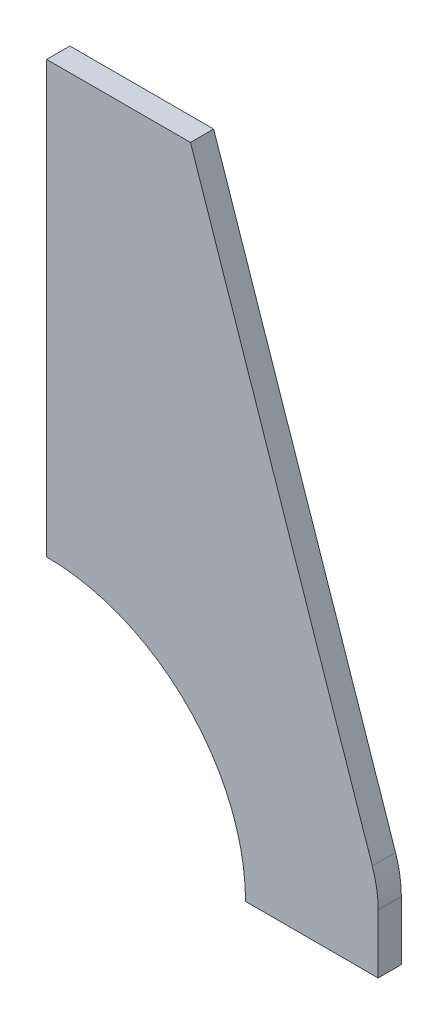
ISO-10303-21;
HEADER;
FILE_DESCRIPTION(('STEP AP214'),'2;1');
FILE_NAME('part.step','',(''),(''),'','','');
FILE_SCHEMA(('AUTOMOTIVE_DESIGN { 1 0 10303 214 1 1 1 1 }'));
ENDSEC;
DATA;
#1=APPLICATION_CONTEXT('core data for automotive mechanical design processes');
#2=APPLICATION_PROTOCOL_DEFINITION('international standard','automotive_design',2000,#1);
#3=PRODUCT_CONTEXT('',#1,'mechanical');
#4=PRODUCT('Part','Part','',(#3));
#5=PRODUCT_RELATED_PRODUCT_CATEGORY('part','',(#4));
#6=PRODUCT_DEFINITION_FORMATION('','',#4);
#7=PRODUCT_DEFINITION_CONTEXT('part definition',#1,'design');
#8=PRODUCT_DEFINITION('design','',#6,#7);
#9=PRODUCT_DEFINITION_SHAPE('','',#8);
#10=(LENGTH_UNIT() NAMED_UNIT(*) SI_UNIT(.MILLI.,.METRE.));
#11=(NAMED_UNIT(*) PLANE_ANGLE_UNIT() SI_UNIT($,.RADIAN.));
#12=(NAMED_UNIT(*) SI_UNIT($,.STERADIAN.) SOLID_ANGLE_UNIT());
#13=UNCERTAINTY_MEASURE_WITH_UNIT(LENGTH_MEASURE(1.E-05),#10,'distance_accuracy_value','');
#14=(GEOMETRIC_REPRESENTATION_CONTEXT(3) GLOBAL_UNCERTAINTY_ASSIGNED_CONTEXT((#13)) GLOBAL_UNIT_ASSIGNED_CONTEXT((#10,
#11,#12)) REPRESENTATION_CONTEXT('',''));
#15=CARTESIAN_POINT('',(0.,0.,0.));
#16=DIRECTION('',(0.,0.,1.));
#17=DIRECTION('',(1.,0.,0.));
#18=AXIS2_PLACEMENT_3D('',#15,#16,#17);
#19=CARTESIAN_POINT('',(26.9481859027112,238.391267528842,7.));
#20=DIRECTION('',(-0.946900493625646,-0.321526756540583,0.));
#21=DIRECTION('',(0.321526756540583,-0.946900493625646,0.));
#22=AXIS2_PLACEMENT_3D('',#19,#20,#21);
#23=PLANE('',#22);
#24=DIRECTION('',(0.,0.,-1.));
#25=VECTOR('',#24,1.);
#26=CARTESIAN_POINT('',(43.3797828848408,190.,7.));
#27=LINE('',#26,#25);
#28=CARTESIAN_POINT('',(43.3797828848408,190.,7.));
#29=VERTEX_POINT('',#28);
#30=CARTESIAN_POINT('',(43.3797828848408,190.,0.));
#31=VERTEX_POINT('',#30);
#32=EDGE_CURVE('E108',#29,#31,#27,.T.);
#33=ORIENTED_EDGE('',*,*,#32,.F.);
#34=DIRECTION('',(-0.321526756540583,0.946900493625646,0.));
#35=VECTOR('',#34,1.);
#36=CARTESIAN_POINT('',(26.9481859027112,238.391267528842,7.));
#37=LINE('',#36,#35);
#38=CARTESIAN_POINT('',(98.2477162896463,28.4132201493107,7.));
#39=VERTEX_POINT('',#38);
#40=EDGE_CURVE('E107',#39,#29,#37,.T.);
#41=ORIENTED_EDGE('',*,*,#40,.F.);
#42=DIRECTION('',(0.,0.,-1.));
#43=VECTOR('',#42,1.);
#44=CARTESIAN_POINT('',(98.2477162896463,28.4132201493107,7.));
#45=LINE('',#44,#43);
#46=CARTESIAN_POINT('',(98.2477162896463,28.4132201493107,0.));
#47=VERTEX_POINT('',#46);
#48=EDGE_CURVE('E144',#39,#47,#45,.T.);
#49=ORIENTED_EDGE('',*,*,#48,.T.);
#50=DIRECTION('',(-0.321526756540583,0.946900493625646,0.));
#51=VECTOR('',#50,1.);
#52=CARTESIAN_POINT('',(26.9481859027112,238.391267528842,0.));
#53=LINE('',#52,#51);
#54=EDGE_CURVE('E134',#47,#31,#53,.T.);
#55=ORIENTED_EDGE('',*,*,#54,.T.);
#56=EDGE_LOOP('',(#33,#41,#49,#55));
#57=FACE_BOUND('',#56,.T.);
#58=ADVANCED_FACE('F39',(#57),#23,.F.);
#59=CARTESIAN_POINT('',(0.,240.,7.));
#60=DIRECTION('',(0.,0.,1.));
#61=DIRECTION('',(1.,0.,0.));
#62=AXIS2_PLACEMENT_3D('',#59,#60,#61);
#63=PLANE('',#62);
#64=ORIENTED_EDGE('',*,*,#40,.T.);
#65=DIRECTION('',(-1.,0.,0.));
#66=VECTOR('',#65,1.);
#67=CARTESIAN_POINT('',(0.,190.,7.));
#68=LINE('',#67,#66);
#69=CARTESIAN_POINT('',(0.,190.,7.));
#70=VERTEX_POINT('',#69);
#71=EDGE_CURVE('E96',#29,#70,#68,.T.);
#72=ORIENTED_EDGE('',*,*,#71,.T.);
#73=DIRECTION('',(0.,1.,0.));
#74=VECTOR('',#73,1.);
#75=CARTESIAN_POINT('',(0.,240.,7.));
#76=LINE('',#75,#74);
#77=CARTESIAN_POINT('',(0.,60.,7.));
#78=VERTEX_POINT('',#77);
#79=EDGE_CURVE('E104',#78,#70,#76,.T.);
#80=ORIENTED_EDGE('',*,*,#79,.F.);
#81=CARTESIAN_POINT('',(0.,0.,7.));
#82=DIRECTION('',(0.,0.,1.));
#83=DIRECTION('',(1.,0.,0.));
#84=AXIS2_PLACEMENT_3D('',#81,#82,#83);
#85=CIRCLE('',#84,60.);
#86=CARTESIAN_POINT('',(60.,0.,7.));
#87=VERTEX_POINT('',#86);
#88=EDGE_CURVE('E111',#87,#78,#85,.T.);
#89=ORIENTED_EDGE('',*,*,#88,.F.);
#90=DIRECTION('',(1.,0.,0.));
#91=VECTOR('',#90,1.);
#92=CARTESIAN_POINT('',(-100.,0.,7.));
#93=LINE('',#92,#91);
#94=CARTESIAN_POINT('',(100.,0.,7.));
#95=VERTEX_POINT('',#94);
#96=EDGE_CURVE('E129',#87,#95,#93,.T.);
#97=ORIENTED_EDGE('',*,*,#96,.T.);
#98=DIRECTION('',(0.,1.,0.));
#99=VECTOR('',#98,1.);
#100=CARTESIAN_POINT('',(100.,23.2527217567091,7.));
#101=LINE('',#100,#99);
#102=CARTESIAN_POINT('',(100.,17.8028371834714,7.));
#103=VERTEX_POINT('',#102);
#104=EDGE_CURVE('E124',#95,#103,#101,.T.);
#105=ORIENTED_EDGE('',*,*,#104,.T.);
#106=CARTESIAN_POINT('',(67.,17.8028371834714,7.));
#107=DIRECTION('',(0.,0.,1.));
#108=DIRECTION('',(1.,0.,0.));
#109=AXIS2_PLACEMENT_3D('',#106,#107,#108);
#110=CIRCLE('',#109,33.);
#111=EDGE_CURVE('E142',#103,#39,#110,.T.);
#112=ORIENTED_EDGE('',*,*,#111,.T.);
#113=EDGE_LOOP('',(#64,#72,#80,#89,#97,#105,#112));
#114=FACE_BOUND('',#113,.T.);
#115=ADVANCED_FACE('F102',(#114),#63,.T.);
#116=CARTESIAN_POINT('',(0.,240.,0.));
#117=DIRECTION('',(0.,0.,1.));
#118=DIRECTION('',(1.,0.,0.));
#119=AXIS2_PLACEMENT_3D('',#116,#117,#118);
#120=PLANE('',#119);
#121=DIRECTION('',(-1.,0.,0.));
#122=VECTOR('',#121,1.);
#123=CARTESIAN_POINT('',(0.,190.,0.));
#124=LINE('',#123,#122);
#125=CARTESIAN_POINT('',(0.,190.,0.));
#126=VERTEX_POINT('',#125);
#127=EDGE_CURVE('E53',#31,#126,#124,.T.);
#128=ORIENTED_EDGE('',*,*,#127,.F.);
#129=ORIENTED_EDGE('',*,*,#54,.F.);
#130=CARTESIAN_POINT('',(67.,17.8028371834714,0.));
#131=DIRECTION('',(0.,0.,1.));
#132=DIRECTION('',(1.,0.,0.));
#133=AXIS2_PLACEMENT_3D('',#130,#131,#132);
#134=CIRCLE('',#133,33.);
#135=CARTESIAN_POINT('',(100.,17.8028371834714,0.));
#136=VERTEX_POINT('',#135);
#137=EDGE_CURVE('E140',#47,#136,#134,.F.);
#138=ORIENTED_EDGE('',*,*,#137,.T.);
#139=DIRECTION('',(0.,1.,0.));
#140=VECTOR('',#139,1.);
#141=CARTESIAN_POINT('',(100.,23.2527217567091,0.));
#142=LINE('',#141,#140);
#143=CARTESIAN_POINT('',(100.,0.,0.));
#144=VERTEX_POINT('',#143);
#145=EDGE_CURVE('E123',#144,#136,#142,.T.);
#146=ORIENTED_EDGE('',*,*,#145,.F.);
#147=DIRECTION('',(1.,0.,0.));
#148=VECTOR('',#147,1.);
#149=CARTESIAN_POINT('',(-100.,0.,0.));
#150=LINE('',#149,#148);
#151=CARTESIAN_POINT('',(60.,0.,0.));
#152=VERTEX_POINT('',#151);
#153=EDGE_CURVE('E127',#152,#144,#150,.T.);
#154=ORIENTED_EDGE('',*,*,#153,.F.);
#155=CARTESIAN_POINT('',(0.,0.,0.));
#156=DIRECTION('',(0.,0.,1.));
#157=DIRECTION('',(1.,0.,0.));
#158=AXIS2_PLACEMENT_3D('',#155,#156,#157);
#159=CIRCLE('',#158,60.);
#160=CARTESIAN_POINT('',(0.,60.,0.));
#161=VERTEX_POINT('',#160);
#162=EDGE_CURVE('E113',#152,#161,#159,.T.);
#163=ORIENTED_EDGE('',*,*,#162,.T.);
#164=DIRECTION('',(0.,1.,0.));
#165=VECTOR('',#164,1.);
#166=CARTESIAN_POINT('',(0.,240.,0.));
#167=LINE('',#166,#165);
#168=EDGE_CURVE('E60',#161,#126,#167,.T.);
#169=ORIENTED_EDGE('',*,*,#168,.T.);
#170=EDGE_LOOP('',(#128,#129,#138,#146,#154,#163,#169));
#171=FACE_BOUND('',#170,.T.);
#172=ADVANCED_FACE('F152',(#171),#120,.F.);
#173=CARTESIAN_POINT('',(0.,0.,0.));
#174=DIRECTION('',(1.,0.,0.));
#175=DIRECTION('',(0.,0.,-1.));
#176=AXIS2_PLACEMENT_3D('',#173,#174,#175);
#177=PLANE('',#176);
#178=DIRECTION('',(0.,0.,1.));
#179=VECTOR('',#178,1.);
#180=CARTESIAN_POINT('',(0.,190.,0.));
#181=LINE('',#180,#179);
#182=EDGE_CURVE('E11',#126,#70,#181,.T.);
#183=ORIENTED_EDGE('',*,*,#182,.F.);
#184=ORIENTED_EDGE('',*,*,#168,.F.);
#185=DIRECTION('',(0.,0.,1.));
#186=VECTOR('',#185,1.);
#187=CARTESIAN_POINT('',(0.,60.,0.));
#188=LINE('',#187,#186);
#189=EDGE_CURVE('E47',#78,#161,#188,.F.);
#190=ORIENTED_EDGE('',*,*,#189,.F.);
#191=ORIENTED_EDGE('',*,*,#79,.T.);
#192=EDGE_LOOP('',(#183,#184,#190,#191));
#193=FACE_BOUND('',#192,.T.);
#194=ADVANCED_FACE('F110',(#193),#177,.F.);
#195=CARTESIAN_POINT('',(100.,23.2527217567091,7.));
#196=DIRECTION('',(-1.,0.,0.));
#197=DIRECTION('',(0.,0.,1.));
#198=AXIS2_PLACEMENT_3D('',#195,#196,#197);
#199=PLANE('',#198);
#200=ORIENTED_EDGE('',*,*,#145,.T.);
#201=DIRECTION('',(0.,0.,-1.));
#202=VECTOR('',#201,1.);
#203=CARTESIAN_POINT('',(100.,17.8028371834714,7.));
#204=LINE('',#203,#202);
#205=EDGE_CURVE('E147',#136,#103,#204,.F.);
#206=ORIENTED_EDGE('',*,*,#205,.T.);
#207=ORIENTED_EDGE('',*,*,#104,.F.);
#208=DIRECTION('',(0.,0.,-1.));
#209=VECTOR('',#208,1.);
#210=CARTESIAN_POINT('',(100.,0.,7.));
#211=LINE('',#210,#209);
#212=EDGE_CURVE('E131',#95,#144,#211,.T.);
#213=ORIENTED_EDGE('',*,*,#212,.T.);
#214=EDGE_LOOP('',(#200,#206,#207,#213));
#215=FACE_BOUND('',#214,.T.);
#216=ADVANCED_FACE('F160',(#215),#199,.F.);
#217=CARTESIAN_POINT('',(-100.,0.,7.));
#218=DIRECTION('',(0.,1.,0.));
#219=DIRECTION('',(-1.,0.,0.));
#220=AXIS2_PLACEMENT_3D('',#217,#218,#219);
#221=PLANE('',#220);
#222=ORIENTED_EDGE('',*,*,#96,.F.);
#223=DIRECTION('',(0.,0.,1.));
#224=VECTOR('',#223,1.);
#225=CARTESIAN_POINT('',(60.,0.,0.));
#226=LINE('',#225,#224);
#227=EDGE_CURVE('E119',#87,#152,#226,.F.);
#228=ORIENTED_EDGE('',*,*,#227,.T.);
#229=ORIENTED_EDGE('',*,*,#153,.T.);
#230=ORIENTED_EDGE('',*,*,#212,.F.);
#231=EDGE_LOOP('',(#222,#228,#229,#230));
#232=FACE_BOUND('',#231,.T.);
#233=ADVANCED_FACE('F157',(#232),#221,.F.);
#234=CARTESIAN_POINT('',(67.,17.8028371834714,7.));
#235=DIRECTION('',(0.,0.,-1.));
#236=DIRECTION('',(-1.,0.,0.));
#237=AXIS2_PLACEMENT_3D('',#234,#235,#236);
#238=CYLINDRICAL_SURFACE('',#237,33.);
#239=ORIENTED_EDGE('',*,*,#111,.F.);
#240=ORIENTED_EDGE('',*,*,#205,.F.);
#241=ORIENTED_EDGE('',*,*,#137,.F.);
#242=ORIENTED_EDGE('',*,*,#48,.F.);
#243=EDGE_LOOP('',(#239,#240,#241,#242));
#244=FACE_BOUND('',#243,.T.);
#245=ADVANCED_FACE('F41',(#244),#238,.T.);
#246=CARTESIAN_POINT('',(0.,0.,0.));
#247=DIRECTION('',(0.,0.,1.));
#248=DIRECTION('',(1.,0.,0.));
#249=AXIS2_PLACEMENT_3D('',#246,#247,#248);
#250=CYLINDRICAL_SURFACE('',#249,60.);
#251=ORIENTED_EDGE('',*,*,#88,.T.);
#252=ORIENTED_EDGE('',*,*,#189,.T.);
#253=ORIENTED_EDGE('',*,*,#162,.F.);
#254=ORIENTED_EDGE('',*,*,#227,.F.);
#255=EDGE_LOOP('',(#251,#252,#253,#254));
#256=FACE_BOUND('',#255,.T.);
#257=ADVANCED_FACE('F149',(#256),#250,.F.);
#258=CARTESIAN_POINT('',(0.,190.,0.));
#259=DIRECTION('',(0.,1.,0.));
#260=DIRECTION('',(0.,0.,1.));
#261=AXIS2_PLACEMENT_3D('',#258,#259,#260);
#262=PLANE('',#261);
#263=ORIENTED_EDGE('',*,*,#32,.T.);
#264=ORIENTED_EDGE('',*,*,#127,.T.);
#265=ORIENTED_EDGE('',*,*,#182,.T.);
#266=ORIENTED_EDGE('',*,*,#71,.F.);
#267=EDGE_LOOP('',(#263,#264,#265,#266));
#268=FACE_BOUND('',#267,.T.);
#269=ADVANCED_FACE('F95',(#268),#262,.T.);
#270=CLOSED_SHELL('',(#58,#115,#172,#194,#216,#233,#245,#257,#269));
#271=MANIFOLD_SOLID_BREP('B2',#270);
#272=ADVANCED_BREP_SHAPE_REPRESENTATION('',(#18,#271),#14);
#273=SHAPE_DEFINITION_REPRESENTATION(#9,#272);
ENDSEC;
END-ISO-10303-21;
